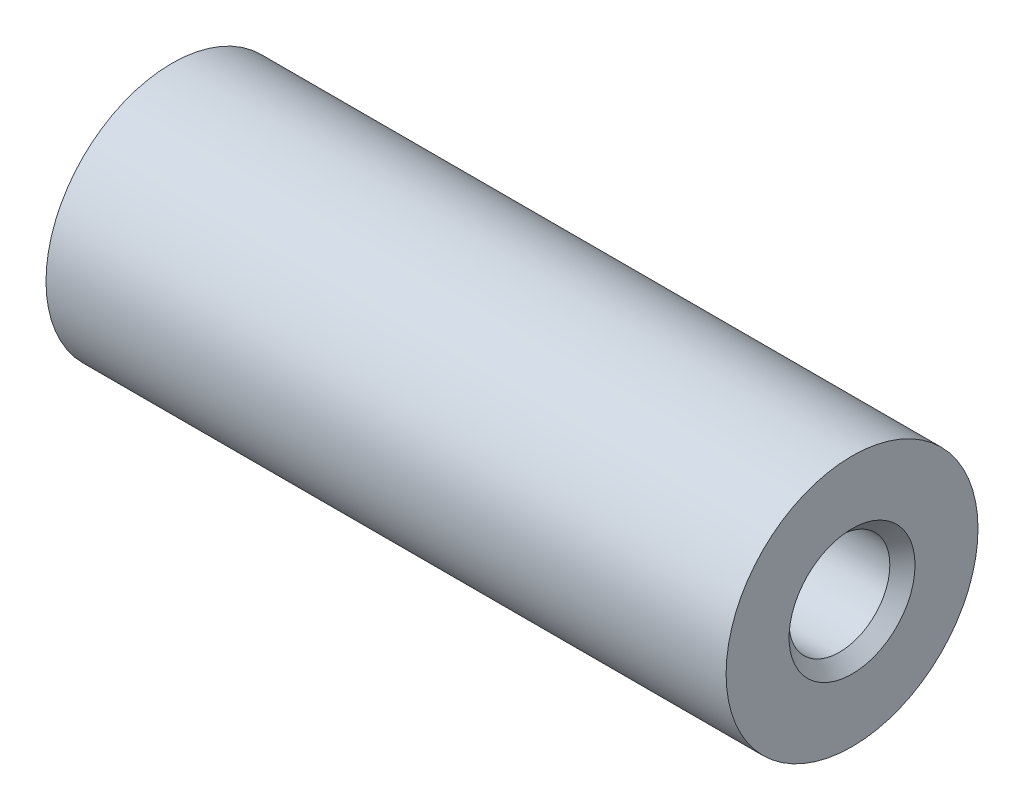
ISO-10303-21;
HEADER;
FILE_DESCRIPTION(('STEP AP214'),'2;1');
FILE_NAME('part.step','',(''),(''),'','','');
FILE_SCHEMA(('AUTOMOTIVE_DESIGN { 1 0 10303 214 1 1 1 1 }'));
ENDSEC;
DATA;
#1=APPLICATION_CONTEXT('core data for automotive mechanical design processes');
#2=APPLICATION_PROTOCOL_DEFINITION('international standard','automotive_design',2000,#1);
#3=PRODUCT_CONTEXT('',#1,'mechanical');
#4=PRODUCT('Part','Part','',(#3));
#5=PRODUCT_RELATED_PRODUCT_CATEGORY('part','',(#4));
#6=PRODUCT_DEFINITION_FORMATION('','',#4);
#7=PRODUCT_DEFINITION_CONTEXT('part definition',#1,'design');
#8=PRODUCT_DEFINITION('design','',#6,#7);
#9=PRODUCT_DEFINITION_SHAPE('','',#8);
#10=(LENGTH_UNIT() NAMED_UNIT(*) SI_UNIT(.MILLI.,.METRE.));
#11=(NAMED_UNIT(*) PLANE_ANGLE_UNIT() SI_UNIT($,.RADIAN.));
#12=(NAMED_UNIT(*) SI_UNIT($,.STERADIAN.) SOLID_ANGLE_UNIT());
#13=UNCERTAINTY_MEASURE_WITH_UNIT(LENGTH_MEASURE(1.E-05),#10,'distance_accuracy_value','');
#14=(GEOMETRIC_REPRESENTATION_CONTEXT(3) GLOBAL_UNCERTAINTY_ASSIGNED_CONTEXT((#13)) GLOBAL_UNIT_ASSIGNED_CONTEXT((#10,
#11,#12)) REPRESENTATION_CONTEXT('',''));
#15=CARTESIAN_POINT('',(0.,0.,0.));
#16=DIRECTION('',(0.,0.,1.));
#17=DIRECTION('',(1.,0.,0.));
#18=AXIS2_PLACEMENT_3D('',#15,#16,#17);
#19=CARTESIAN_POINT('',(21.6,0.,0.));
#20=DIRECTION('',(-1.,0.,0.));
#21=DIRECTION('',(0.,0.,1.));
#22=AXIS2_PLACEMENT_3D('',#19,#20,#21);
#23=CYLINDRICAL_SURFACE('',#22,4.);
#24=CARTESIAN_POINT('',(21.6,0.,0.));
#25=DIRECTION('',(1.,0.,0.));
#26=DIRECTION('',(0.,0.,-1.));
#27=AXIS2_PLACEMENT_3D('',#24,#25,#26);
#28=CIRCLE('',#27,4.);
#29=CARTESIAN_POINT('',(21.6,0.,4.));
#30=VERTEX_POINT('',#29);
#31=EDGE_CURVE('E65',#30,#30,#28,.T.);
#32=CARTESIAN_POINT('',(0.,0.,0.));
#33=DIRECTION('',(1.,0.,0.));
#34=DIRECTION('',(0.,0.,-1.));
#35=AXIS2_PLACEMENT_3D('',#32,#33,#34);
#36=CIRCLE('',#35,4.);
#37=CARTESIAN_POINT('',(0.,0.,4.));
#38=VERTEX_POINT('',#37);
#39=EDGE_CURVE('E61',#38,#38,#36,.T.);
#40=CARTESIAN_POINT('',(21.6,0.,4.));
#41=CARTESIAN_POINT('',(21.375,0.,4.));
#42=CARTESIAN_POINT('',(21.15,0.,4.));
#43=CARTESIAN_POINT('',(20.7,0.,4.));
#44=CARTESIAN_POINT('',(20.475,0.,4.));
#45=CARTESIAN_POINT('',(20.025,0.,4.));
#46=CARTESIAN_POINT('',(19.8,0.,4.));
#47=CARTESIAN_POINT('',(19.35,0.,4.));
#48=CARTESIAN_POINT('',(19.125,0.,4.));
#49=CARTESIAN_POINT('',(18.675,0.,4.));
#50=CARTESIAN_POINT('',(18.45,0.,4.));
#51=CARTESIAN_POINT('',(18.,0.,4.));
#52=CARTESIAN_POINT('',(17.775,0.,4.));
#53=CARTESIAN_POINT('',(17.325,0.,4.));
#54=CARTESIAN_POINT('',(17.1,0.,4.));
#55=CARTESIAN_POINT('',(16.65,0.,4.));
#56=CARTESIAN_POINT('',(16.425,0.,4.));
#57=CARTESIAN_POINT('',(15.975,0.,4.));
#58=CARTESIAN_POINT('',(15.75,0.,4.));
#59=CARTESIAN_POINT('',(15.3,0.,4.));
#60=CARTESIAN_POINT('',(15.075,0.,4.));
#61=CARTESIAN_POINT('',(14.625,0.,4.));
#62=CARTESIAN_POINT('',(14.4,0.,4.));
#63=CARTESIAN_POINT('',(13.95,0.,4.));
#64=CARTESIAN_POINT('',(13.725,0.,4.));
#65=CARTESIAN_POINT('',(13.275,0.,4.));
#66=CARTESIAN_POINT('',(13.05,0.,4.));
#67=CARTESIAN_POINT('',(12.6,0.,4.));
#68=CARTESIAN_POINT('',(12.375,0.,4.));
#69=CARTESIAN_POINT('',(11.925,0.,4.));
#70=CARTESIAN_POINT('',(11.7,0.,4.));
#71=CARTESIAN_POINT('',(11.25,0.,4.));
#72=CARTESIAN_POINT('',(11.025,0.,4.));
#73=CARTESIAN_POINT('',(10.575,0.,4.));
#74=CARTESIAN_POINT('',(10.35,0.,4.));
#75=CARTESIAN_POINT('',(9.9,0.,4.));
#76=CARTESIAN_POINT('',(9.675,0.,4.));
#77=CARTESIAN_POINT('',(9.225,0.,4.));
#78=CARTESIAN_POINT('',(9.,0.,4.));
#79=CARTESIAN_POINT('',(8.55,0.,4.));
#80=CARTESIAN_POINT('',(8.325,0.,4.));
#81=CARTESIAN_POINT('',(7.875,0.,4.));
#82=CARTESIAN_POINT('',(7.65,0.,4.));
#83=CARTESIAN_POINT('',(7.2,0.,4.));
#84=CARTESIAN_POINT('',(6.975,0.,4.));
#85=CARTESIAN_POINT('',(6.525,0.,4.));
#86=CARTESIAN_POINT('',(6.3,0.,4.));
#87=CARTESIAN_POINT('',(5.85,0.,4.));
#88=CARTESIAN_POINT('',(5.625,0.,4.));
#89=CARTESIAN_POINT('',(5.175,0.,4.));
#90=CARTESIAN_POINT('',(4.95,0.,4.));
#91=CARTESIAN_POINT('',(4.5,0.,4.));
#92=CARTESIAN_POINT('',(4.275,0.,4.));
#93=CARTESIAN_POINT('',(3.825,0.,4.));
#94=CARTESIAN_POINT('',(3.6,0.,4.));
#95=CARTESIAN_POINT('',(3.15,0.,4.));
#96=CARTESIAN_POINT('',(2.925,0.,4.));
#97=CARTESIAN_POINT('',(2.475,0.,4.));
#98=CARTESIAN_POINT('',(2.25,0.,4.));
#99=CARTESIAN_POINT('',(1.8,0.,4.));
#100=CARTESIAN_POINT('',(1.575,0.,4.));
#101=CARTESIAN_POINT('',(1.125,0.,4.));
#102=CARTESIAN_POINT('',(0.899999999999996,0.,4.));
#103=CARTESIAN_POINT('',(0.449999999999996,0.,4.));
#104=CARTESIAN_POINT('',(0.224999999999996,0.,4.));
#105=CARTESIAN_POINT('',(0.,0.,4.));
#106=B_SPLINE_CURVE_WITH_KNOTS('',3,(#40,#41,#42,#43,#44,#45,#46,#47,#48,#49,#50,#51,#52,#53,
#54,#55,#56,#57,#58,#59,#60,#61,#62,#63,#64,#65,#66,#67,#68,#69,#70,#71,#72,#73,#74,#75,#76,#77,
#78,#79,#80,#81,#82,#83,#84,#85,#86,#87,#88,#89,#90,#91,#92,#93,#94,#95,#96,#97,#98,#99,#100,
#101,#102,#103,#104,#105),.UNSPECIFIED.,.F.,.F.,(4,2,2,2,2,2,2,2,2,2,2,2,2,2,2,2,2,2,2,2,2,2,2,
2,2,2,2,2,2,2,2,2,4),(0.,0.674999999999998,1.35,2.025,2.7,3.375,4.05,4.725,5.4,6.075,6.75,7.425,
8.1,8.775,9.45,10.125,10.8,11.475,12.15,12.825,13.5,14.175,14.85,15.525,16.2,16.875,17.55,
18.225,18.9,19.575,20.25,20.925,21.6),.UNSPECIFIED.);
#107=EDGE_CURVE('BSEAM41',#30,#38,#106,.T.);
#108=ORIENTED_EDGE('',*,*,#31,.F.);
#109=ORIENTED_EDGE('',*,*,#39,.T.);
#110=ORIENTED_EDGE('',*,*,#107,.T.);
#111=ORIENTED_EDGE('',*,*,#107,.F.);
#112=EDGE_LOOP('',(#108,#110,#109,#111));
#113=FACE_BOUND('',#112,.T.);
#114=ADVANCED_FACE('F41',(#113),#23,.T.);
#115=CARTESIAN_POINT('',(21.6,0.,0.));
#116=DIRECTION('',(1.,0.,0.));
#117=DIRECTION('',(0.,0.,-1.));
#118=AXIS2_PLACEMENT_3D('',#115,#116,#117);
#119=PLANE('',#118);
#120=CARTESIAN_POINT('',(21.6,0.,0.));
#121=DIRECTION('',(1.,0.,0.));
#122=DIRECTION('',(0.,0.,-1.));
#123=AXIS2_PLACEMENT_3D('',#120,#121,#122);
#124=CIRCLE('',#123,1.99999999999999);
#125=CARTESIAN_POINT('',(21.6,0.,-1.99999999999999));
#126=VERTEX_POINT('',#125);
#127=EDGE_CURVE('E10',#126,#126,#124,.F.);
#128=ORIENTED_EDGE('',*,*,#127,.T.);
#129=EDGE_LOOP('',(#128));
#130=FACE_BOUND('',#129,.T.);
#131=ORIENTED_EDGE('',*,*,#31,.T.);
#132=EDGE_LOOP('',(#131));
#133=FACE_BOUND('',#132,.T.);
#134=ADVANCED_FACE('F70',(#130,#133),#119,.T.);
#135=CARTESIAN_POINT('',(0.,0.,0.));
#136=DIRECTION('',(1.,0.,0.));
#137=DIRECTION('',(0.,0.,-1.));
#138=AXIS2_PLACEMENT_3D('',#135,#136,#137);
#139=PLANE('',#138);
#140=CARTESIAN_POINT('',(0.,0.,0.));
#141=DIRECTION('',(1.,0.,0.));
#142=DIRECTION('',(0.,0.,-1.));
#143=AXIS2_PLACEMENT_3D('',#140,#141,#142);
#144=CIRCLE('',#143,2.);
#145=CARTESIAN_POINT('',(0.,0.,-2.));
#146=VERTEX_POINT('',#145);
#147=EDGE_CURVE('E60',#146,#146,#144,.T.);
#148=ORIENTED_EDGE('',*,*,#147,.T.);
#149=EDGE_LOOP('',(#148));
#150=FACE_BOUND('',#149,.T.);
#151=ORIENTED_EDGE('',*,*,#39,.F.);
#152=EDGE_LOOP('',(#151));
#153=FACE_BOUND('',#152,.T.);
#154=ADVANCED_FACE('F78',(#150,#153),#139,.F.);
#155=CARTESIAN_POINT('',(21.6,0.,0.));
#156=DIRECTION('',(1.,0.,0.));
#157=DIRECTION('',(0.,0.,-1.));
#158=AXIS2_PLACEMENT_3D('',#155,#156,#157);
#159=CYLINDRICAL_SURFACE('',#158,1.59999999999999);
#160=CARTESIAN_POINT('',(0.400000000000008,0.,0.));
#161=DIRECTION('',(1.,0.,0.));
#162=DIRECTION('',(0.,0.,-1.));
#163=AXIS2_PLACEMENT_3D('',#160,#161,#162);
#164=CIRCLE('',#163,1.59999999999999);
#165=CARTESIAN_POINT('',(0.400000000000008,0.,-1.59999999999999));
#166=VERTEX_POINT('',#165);
#167=EDGE_CURVE('E47',#166,#166,#164,.F.);
#168=ORIENTED_EDGE('',*,*,#167,.T.);
#169=EDGE_LOOP('',(#168));
#170=FACE_BOUND('',#169,.T.);
#171=CARTESIAN_POINT('',(21.2,0.,0.));
#172=DIRECTION('',(1.,0.,0.));
#173=DIRECTION('',(0.,0.,-1.));
#174=AXIS2_PLACEMENT_3D('',#171,#172,#173);
#175=CIRCLE('',#174,1.59999999999999);
#176=CARTESIAN_POINT('',(21.2,0.,-1.59999999999999));
#177=VERTEX_POINT('',#176);
#178=EDGE_CURVE('E52',#177,#177,#175,.T.);
#179=ORIENTED_EDGE('',*,*,#178,.T.);
#180=EDGE_LOOP('',(#179));
#181=FACE_BOUND('',#180,.T.);
#182=ADVANCED_FACE('F76',(#170,#181),#159,.F.);
#183=CARTESIAN_POINT('',(0.,0.,0.));
#184=DIRECTION('',(-1.,0.,0.));
#185=DIRECTION('',(0.,0.,1.));
#186=AXIS2_PLACEMENT_3D('',#183,#184,#185);
#187=CONICAL_SURFACE('',#186,2.,0.785398163397446);
#188=ORIENTED_EDGE('',*,*,#167,.F.);
#189=EDGE_LOOP('',(#188));
#190=FACE_BOUND('',#189,.T.);
#191=ORIENTED_EDGE('',*,*,#147,.F.);
#192=EDGE_LOOP('',(#191));
#193=FACE_BOUND('',#192,.T.);
#194=ADVANCED_FACE('F81',(#190,#193),#187,.F.);
#195=CARTESIAN_POINT('',(21.2,0.,0.));
#196=DIRECTION('',(1.,0.,0.));
#197=DIRECTION('',(0.,0.,-1.));
#198=AXIS2_PLACEMENT_3D('',#195,#196,#197);
#199=CONICAL_SURFACE('',#198,1.59999999999999,0.785398163397446);
#200=ORIENTED_EDGE('',*,*,#127,.F.);
#201=EDGE_LOOP('',(#200));
#202=FACE_BOUND('',#201,.T.);
#203=ORIENTED_EDGE('',*,*,#178,.F.);
#204=EDGE_LOOP('',(#203));
#205=FACE_BOUND('',#204,.T.);
#206=ADVANCED_FACE('F42',(#202,#205),#199,.F.);
#207=CLOSED_SHELL('',(#114,#134,#154,#182,#194,#206));
#208=MANIFOLD_SOLID_BREP('B2',#207);
#209=ADVANCED_BREP_SHAPE_REPRESENTATION('',(#18,#208),#14);
#210=SHAPE_DEFINITION_REPRESENTATION(#9,#209);
ENDSEC;
END-ISO-10303-21;
